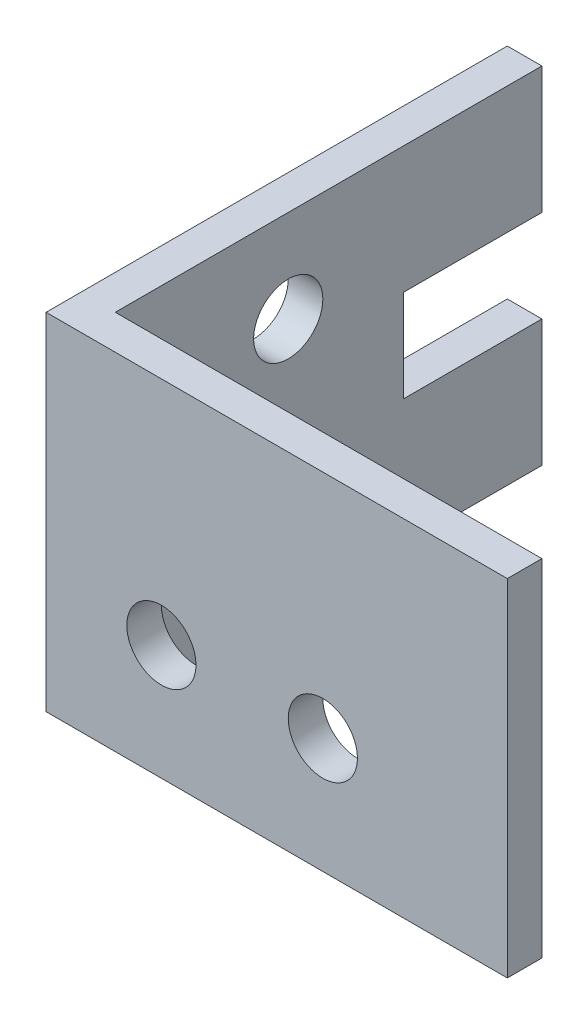
ISO-10303-21;
HEADER;
FILE_DESCRIPTION(('STEP AP214'),'2;1');
FILE_NAME('part.step','',(''),(''),'','','');
FILE_SCHEMA(('AUTOMOTIVE_DESIGN { 1 0 10303 214 1 1 1 1 }'));
ENDSEC;
DATA;
#1=APPLICATION_CONTEXT('core data for automotive mechanical design processes');
#2=APPLICATION_PROTOCOL_DEFINITION('international standard','automotive_design',2000,#1);
#3=PRODUCT_CONTEXT('',#1,'mechanical');
#4=PRODUCT('Part','Part','',(#3));
#5=PRODUCT_RELATED_PRODUCT_CATEGORY('part','',(#4));
#6=PRODUCT_DEFINITION_FORMATION('','',#4);
#7=PRODUCT_DEFINITION_CONTEXT('part definition',#1,'design');
#8=PRODUCT_DEFINITION('design','',#6,#7);
#9=PRODUCT_DEFINITION_SHAPE('','',#8);
#10=(LENGTH_UNIT() NAMED_UNIT(*) SI_UNIT(.MILLI.,.METRE.));
#11=(NAMED_UNIT(*) PLANE_ANGLE_UNIT() SI_UNIT($,.RADIAN.));
#12=(NAMED_UNIT(*) SI_UNIT($,.STERADIAN.) SOLID_ANGLE_UNIT());
#13=UNCERTAINTY_MEASURE_WITH_UNIT(LENGTH_MEASURE(1.E-05),#10,'distance_accuracy_value','');
#14=(GEOMETRIC_REPRESENTATION_CONTEXT(3) GLOBAL_UNCERTAINTY_ASSIGNED_CONTEXT((#13)) GLOBAL_UNIT_ASSIGNED_CONTEXT((#10,
#11,#12)) REPRESENTATION_CONTEXT('',''));
#15=CARTESIAN_POINT('',(0.,0.,0.));
#16=DIRECTION('',(0.,0.,1.));
#17=DIRECTION('',(1.,0.,0.));
#18=AXIS2_PLACEMENT_3D('',#15,#16,#17);
#19=CARTESIAN_POINT('',(-14.8743716496824,15.,-4.40932851023177));
#20=DIRECTION('',(0.,0.,1.));
#21=DIRECTION('',(1.,0.,0.));
#22=AXIS2_PLACEMENT_3D('',#19,#20,#21);
#23=PLANE('',#22);
#24=DIRECTION('',(0.,-1.,0.));
#25=VECTOR('',#24,1.);
#26=CARTESIAN_POINT('',(-13.3743716496824,15.,-4.40932851023177));
#27=LINE('',#26,#25);
#28=CARTESIAN_POINT('',(-13.3743716496824,15.,-4.40932851023177));
#29=VERTEX_POINT('',#28);
#30=CARTESIAN_POINT('',(-13.3743716496824,9.5,-4.40932851023177));
#31=VERTEX_POINT('',#30);
#32=EDGE_CURVE('E146',#29,#31,#27,.T.);
#33=ORIENTED_EDGE('',*,*,#32,.T.);
#34=DIRECTION('',(-1.,0.,0.));
#35=VECTOR('',#34,1.);
#36=CARTESIAN_POINT('',(-14.8743716496824,9.5,-4.40932851023177));
#37=LINE('',#36,#35);
#38=CARTESIAN_POINT('',(-14.8743716496824,9.5,-4.40932851023177));
#39=VERTEX_POINT('',#38);
#40=EDGE_CURVE('E116',#31,#39,#37,.T.);
#41=ORIENTED_EDGE('',*,*,#40,.T.);
#42=DIRECTION('',(0.,-1.,0.));
#43=VECTOR('',#42,1.);
#44=CARTESIAN_POINT('',(-14.8743716496824,15.,-4.40932851023177));
#45=LINE('',#44,#43);
#46=CARTESIAN_POINT('',(-14.8743716496824,15.,-4.40932851023177));
#47=VERTEX_POINT('',#46);
#48=EDGE_CURVE('E114',#47,#39,#45,.T.);
#49=ORIENTED_EDGE('',*,*,#48,.F.);
#50=DIRECTION('',(-1.,0.,0.));
#51=VECTOR('',#50,1.);
#52=CARTESIAN_POINT('',(-14.8743716496824,15.,-4.40932851023177));
#53=LINE('',#52,#51);
#54=EDGE_CURVE('E100',#29,#47,#53,.T.);
#55=ORIENTED_EDGE('',*,*,#54,.F.);
#56=EDGE_LOOP('',(#33,#41,#49,#55));
#57=FACE_BOUND('',#56,.T.);
#58=ADVANCED_FACE('F31',(#57),#23,.F.);
#59=CARTESIAN_POINT('',(5.12562835031758,15.,14.0906714897682));
#60=DIRECTION('',(-1.,0.,0.));
#61=DIRECTION('',(0.,0.,1.));
#62=AXIS2_PLACEMENT_3D('',#59,#60,#61);
#63=PLANE('',#62);
#64=DIRECTION('',(0.,0.,-1.));
#65=VECTOR('',#64,1.);
#66=CARTESIAN_POINT('',(5.12562835031758,0.,14.0906714897682));
#67=LINE('',#66,#65);
#68=CARTESIAN_POINT('',(5.12562835031758,0.,15.5906714897682));
#69=VERTEX_POINT('',#68);
#70=CARTESIAN_POINT('',(5.12562835031758,0.,14.0906714897682));
#71=VERTEX_POINT('',#70);
#72=EDGE_CURVE('E128',#69,#71,#67,.T.);
#73=ORIENTED_EDGE('',*,*,#72,.T.);
#74=DIRECTION('',(0.,-1.,0.));
#75=VECTOR('',#74,1.);
#76=CARTESIAN_POINT('',(5.12562835031758,15.,14.0906714897682));
#77=LINE('',#76,#75);
#78=CARTESIAN_POINT('',(5.12562835031758,15.,14.0906714897682));
#79=VERTEX_POINT('',#78);
#80=EDGE_CURVE('E151',#79,#71,#77,.T.);
#81=ORIENTED_EDGE('',*,*,#80,.F.);
#82=DIRECTION('',(0.,0.,-1.));
#83=VECTOR('',#82,1.);
#84=CARTESIAN_POINT('',(5.12562835031758,15.,14.0906714897682));
#85=LINE('',#84,#83);
#86=CARTESIAN_POINT('',(5.12562835031758,15.,15.5906714897682));
#87=VERTEX_POINT('',#86);
#88=EDGE_CURVE('E143',#87,#79,#85,.T.);
#89=ORIENTED_EDGE('',*,*,#88,.F.);
#90=DIRECTION('',(0.,-1.,0.));
#91=VECTOR('',#90,1.);
#92=CARTESIAN_POINT('',(5.12562835031758,15.,15.5906714897682));
#93=LINE('',#92,#91);
#94=EDGE_CURVE('E124',#87,#69,#93,.T.);
#95=ORIENTED_EDGE('',*,*,#94,.T.);
#96=EDGE_LOOP('',(#73,#81,#89,#95));
#97=FACE_BOUND('',#96,.T.);
#98=ADVANCED_FACE('F33',(#97),#63,.F.);
#99=CARTESIAN_POINT('',(-13.3743716496824,15.,14.0906714897682));
#100=DIRECTION('',(0.,0.,1.));
#101=DIRECTION('',(1.,0.,0.));
#102=AXIS2_PLACEMENT_3D('',#99,#100,#101);
#103=PLANE('',#102);
#104=CARTESIAN_POINT('',(-9.87437164968241,5.,14.0906714897682));
#105=DIRECTION('',(0.,0.,-1.));
#106=DIRECTION('',(-1.,0.,0.));
#107=AXIS2_PLACEMENT_3D('',#104,#105,#106);
#108=CIRCLE('',#107,1.5);
#109=CARTESIAN_POINT('',(-11.3743716496824,5.,14.0906714897682));
#110=VERTEX_POINT('',#109);
#111=EDGE_CURVE('E160',#110,#110,#108,.T.);
#112=ORIENTED_EDGE('',*,*,#111,.F.);
#113=EDGE_LOOP('',(#112));
#114=FACE_BOUND('',#113,.T.);
#115=CARTESIAN_POINT('',(-2.87437164968242,5.,14.0906714897682));
#116=DIRECTION('',(0.,0.,-1.));
#117=DIRECTION('',(-1.,0.,0.));
#118=AXIS2_PLACEMENT_3D('',#115,#116,#117);
#119=CIRCLE('',#118,1.5);
#120=CARTESIAN_POINT('',(-4.37437164968242,5.,14.0906714897682));
#121=VERTEX_POINT('',#120);
#122=EDGE_CURVE('E156',#121,#121,#119,.T.);
#123=ORIENTED_EDGE('',*,*,#122,.F.);
#124=EDGE_LOOP('',(#123));
#125=FACE_BOUND('',#124,.T.);
#126=DIRECTION('',(-1.,0.,0.));
#127=VECTOR('',#126,1.);
#128=CARTESIAN_POINT('',(-13.3743716496824,0.,14.0906714897682));
#129=LINE('',#128,#127);
#130=CARTESIAN_POINT('',(-13.3743716496824,0.,14.0906714897682));
#131=VERTEX_POINT('',#130);
#132=EDGE_CURVE('E131',#71,#131,#129,.T.);
#133=ORIENTED_EDGE('',*,*,#132,.T.);
#134=DIRECTION('',(0.,-1.,0.));
#135=VECTOR('',#134,1.);
#136=CARTESIAN_POINT('',(-13.3743716496824,15.,14.0906714897682));
#137=LINE('',#136,#135);
#138=CARTESIAN_POINT('',(-13.3743716496824,15.,14.0906714897682));
#139=VERTEX_POINT('',#138);
#140=EDGE_CURVE('E148',#139,#131,#137,.T.);
#141=ORIENTED_EDGE('',*,*,#140,.F.);
#142=DIRECTION('',(-1.,0.,0.));
#143=VECTOR('',#142,1.);
#144=CARTESIAN_POINT('',(-13.3743716496824,15.,14.0906714897682));
#145=LINE('',#144,#143);
#146=EDGE_CURVE('E91',#79,#139,#145,.T.);
#147=ORIENTED_EDGE('',*,*,#146,.F.);
#148=ORIENTED_EDGE('',*,*,#80,.T.);
#149=EDGE_LOOP('',(#133,#141,#147,#148));
#150=FACE_BOUND('',#149,.T.);
#151=ADVANCED_FACE('F212',(#114,#125,#150),#103,.F.);
#152=CARTESIAN_POINT('',(-13.3743716496824,15.,-4.40932851023177));
#153=DIRECTION('',(-1.,0.,0.));
#154=DIRECTION('',(0.,0.,1.));
#155=AXIS2_PLACEMENT_3D('',#152,#153,#154);
#156=PLANE('',#155);
#157=CARTESIAN_POINT('',(-13.3743716496824,11.,6.59067148976823));
#158=DIRECTION('',(1.,0.,0.));
#159=DIRECTION('',(0.,0.,-1.));
#160=AXIS2_PLACEMENT_3D('',#157,#158,#159);
#161=CIRCLE('',#160,1.5);
#162=CARTESIAN_POINT('',(-13.3743716496824,11.,5.09067148976822));
#163=VERTEX_POINT('',#162);
#164=EDGE_CURVE('E168',#163,#163,#161,.T.);
#165=ORIENTED_EDGE('',*,*,#164,.F.);
#166=EDGE_LOOP('',(#165));
#167=FACE_BOUND('',#166,.T.);
#168=CARTESIAN_POINT('',(-13.3743716496824,4.,6.59067148976823));
#169=DIRECTION('',(1.,0.,0.));
#170=DIRECTION('',(0.,0.,-1.));
#171=AXIS2_PLACEMENT_3D('',#168,#169,#170);
#172=CIRCLE('',#171,1.5);
#173=CARTESIAN_POINT('',(-13.3743716496824,4.,5.09067148976822));
#174=VERTEX_POINT('',#173);
#175=EDGE_CURVE('E164',#174,#174,#172,.T.);
#176=ORIENTED_EDGE('',*,*,#175,.F.);
#177=EDGE_LOOP('',(#176));
#178=FACE_BOUND('',#177,.T.);
#179=DIRECTION('',(0.,-1.,0.));
#180=VECTOR('',#179,1.);
#181=CARTESIAN_POINT('',(-13.3743716496824,9.5,1.59067148976823));
#182=LINE('',#181,#180);
#183=CARTESIAN_POINT('',(-13.3743716496824,9.5,1.59067148976823));
#184=VERTEX_POINT('',#183);
#185=CARTESIAN_POINT('',(-13.3743716496824,5.5,1.59067148976823));
#186=VERTEX_POINT('',#185);
#187=EDGE_CURVE('E224',#184,#186,#182,.T.);
#188=ORIENTED_EDGE('',*,*,#187,.F.);
#189=DIRECTION('',(0.,0.,1.));
#190=VECTOR('',#189,1.);
#191=CARTESIAN_POINT('',(-13.3743716496824,9.5,1.59067148976823));
#192=LINE('',#191,#190);
#193=EDGE_CURVE('E192',#31,#184,#192,.T.);
#194=ORIENTED_EDGE('',*,*,#193,.F.);
#195=ORIENTED_EDGE('',*,*,#32,.F.);
#196=DIRECTION('',(0.,0.,-1.));
#197=VECTOR('',#196,1.);
#198=CARTESIAN_POINT('',(-13.3743716496824,15.,-4.40932851023177));
#199=LINE('',#198,#197);
#200=EDGE_CURVE('E107',#139,#29,#199,.T.);
#201=ORIENTED_EDGE('',*,*,#200,.F.);
#202=ORIENTED_EDGE('',*,*,#140,.T.);
#203=DIRECTION('',(0.,0.,-1.));
#204=VECTOR('',#203,1.);
#205=CARTESIAN_POINT('',(-13.3743716496824,0.,-4.40932851023177));
#206=LINE('',#205,#204);
#207=CARTESIAN_POINT('',(-13.3743716496824,0.,-4.40932851023177));
#208=VERTEX_POINT('',#207);
#209=EDGE_CURVE('E134',#131,#208,#206,.T.);
#210=ORIENTED_EDGE('',*,*,#209,.T.);
#211=CARTESIAN_POINT('',(-13.3743716496824,5.5,-4.40932851023177));
#212=VERTEX_POINT('',#211);
#213=EDGE_CURVE('E118',#212,#208,#27,.T.);
#214=ORIENTED_EDGE('',*,*,#213,.F.);
#215=DIRECTION('',(0.,0.,-1.));
#216=VECTOR('',#215,1.);
#217=CARTESIAN_POINT('',(-13.3743716496824,5.5,1.59067148976823));
#218=LINE('',#217,#216);
#219=EDGE_CURVE('E223',#186,#212,#218,.T.);
#220=ORIENTED_EDGE('',*,*,#219,.F.);
#221=EDGE_LOOP('',(#188,#194,#195,#201,#202,#210,#214,#220));
#222=FACE_BOUND('',#221,.T.);
#223=ADVANCED_FACE('F215',(#167,#178,#222),#156,.F.);
#224=CARTESIAN_POINT('',(-14.8743716496824,5.5,-4.40932851023177));
#225=VERTEX_POINT('',#224);
#226=CARTESIAN_POINT('',(-14.8743716496824,0.,-4.40932851023177));
#227=VERTEX_POINT('',#226);
#228=EDGE_CURVE('E119',#225,#227,#45,.T.);
#229=ORIENTED_EDGE('',*,*,#228,.F.);
#230=DIRECTION('',(1.,0.,0.));
#231=VECTOR('',#230,1.);
#232=CARTESIAN_POINT('',(-14.8743716496824,5.5,-4.40932851023177));
#233=LINE('',#232,#231);
#234=EDGE_CURVE('E46',#225,#212,#233,.T.);
#235=ORIENTED_EDGE('',*,*,#234,.T.);
#236=ORIENTED_EDGE('',*,*,#213,.T.);
#237=DIRECTION('',(-1.,0.,0.));
#238=VECTOR('',#237,1.);
#239=CARTESIAN_POINT('',(-14.8743716496824,0.,-4.40932851023177));
#240=LINE('',#239,#238);
#241=EDGE_CURVE('E137',#208,#227,#240,.T.);
#242=ORIENTED_EDGE('',*,*,#241,.T.);
#243=EDGE_LOOP('',(#229,#235,#236,#242));
#244=FACE_BOUND('',#243,.T.);
#245=ADVANCED_FACE('F229',(#244),#23,.F.);
#246=CARTESIAN_POINT('',(-14.8743716496824,15.,15.5906714897682));
#247=DIRECTION('',(1.,0.,0.));
#248=DIRECTION('',(0.,0.,-1.));
#249=AXIS2_PLACEMENT_3D('',#246,#247,#248);
#250=PLANE('',#249);
#251=CARTESIAN_POINT('',(-14.8743716496824,11.,6.59067148976823));
#252=DIRECTION('',(1.,0.,0.));
#253=DIRECTION('',(0.,0.,-1.));
#254=AXIS2_PLACEMENT_3D('',#251,#252,#253);
#255=CIRCLE('',#254,1.5);
#256=CARTESIAN_POINT('',(-14.8743716496824,11.,5.09067148976822));
#257=VERTEX_POINT('',#256);
#258=EDGE_CURVE('E165',#257,#257,#255,.T.);
#259=ORIENTED_EDGE('',*,*,#258,.T.);
#260=EDGE_LOOP('',(#259));
#261=FACE_BOUND('',#260,.T.);
#262=CARTESIAN_POINT('',(-14.8743716496824,4.,6.59067148976823));
#263=DIRECTION('',(1.,0.,0.));
#264=DIRECTION('',(0.,0.,-1.));
#265=AXIS2_PLACEMENT_3D('',#262,#263,#264);
#266=CIRCLE('',#265,1.5);
#267=CARTESIAN_POINT('',(-14.8743716496824,4.,5.09067148976822));
#268=VERTEX_POINT('',#267);
#269=EDGE_CURVE('E161',#268,#268,#266,.T.);
#270=ORIENTED_EDGE('',*,*,#269,.T.);
#271=EDGE_LOOP('',(#270));
#272=FACE_BOUND('',#271,.T.);
#273=ORIENTED_EDGE('',*,*,#48,.T.);
#274=DIRECTION('',(0.,0.,1.));
#275=VECTOR('',#274,1.);
#276=CARTESIAN_POINT('',(-14.8743716496824,9.5,15.5906714897682));
#277=LINE('',#276,#275);
#278=CARTESIAN_POINT('',(-14.8743716496824,9.5,1.59067148976823));
#279=VERTEX_POINT('',#278);
#280=EDGE_CURVE('E11',#39,#279,#277,.T.);
#281=ORIENTED_EDGE('',*,*,#280,.T.);
#282=DIRECTION('',(0.,-1.,0.));
#283=VECTOR('',#282,1.);
#284=CARTESIAN_POINT('',(-14.8743716496824,15.,1.59067148976823));
#285=LINE('',#284,#283);
#286=CARTESIAN_POINT('',(-14.8743716496824,5.5,1.59067148976823));
#287=VERTEX_POINT('',#286);
#288=EDGE_CURVE('E39',#279,#287,#285,.T.);
#289=ORIENTED_EDGE('',*,*,#288,.T.);
#290=DIRECTION('',(0.,0.,-1.));
#291=VECTOR('',#290,1.);
#292=CARTESIAN_POINT('',(-14.8743716496824,5.5,15.5906714897682));
#293=LINE('',#292,#291);
#294=EDGE_CURVE('E153',#287,#225,#293,.T.);
#295=ORIENTED_EDGE('',*,*,#294,.T.);
#296=ORIENTED_EDGE('',*,*,#228,.T.);
#297=DIRECTION('',(0.,0.,1.));
#298=VECTOR('',#297,1.);
#299=CARTESIAN_POINT('',(-14.8743716496824,0.,15.5906714897682));
#300=LINE('',#299,#298);
#301=CARTESIAN_POINT('',(-14.8743716496824,0.,15.5906714897682));
#302=VERTEX_POINT('',#301);
#303=EDGE_CURVE('E140',#227,#302,#300,.T.);
#304=ORIENTED_EDGE('',*,*,#303,.T.);
#305=DIRECTION('',(0.,-1.,0.));
#306=VECTOR('',#305,1.);
#307=CARTESIAN_POINT('',(-14.8743716496824,15.,15.5906714897682));
#308=LINE('',#307,#306);
#309=CARTESIAN_POINT('',(-14.8743716496824,15.,15.5906714897682));
#310=VERTEX_POINT('',#309);
#311=EDGE_CURVE('E122',#310,#302,#308,.T.);
#312=ORIENTED_EDGE('',*,*,#311,.F.);
#313=DIRECTION('',(0.,0.,1.));
#314=VECTOR('',#313,1.);
#315=CARTESIAN_POINT('',(-14.8743716496824,15.,15.5906714897682));
#316=LINE('',#315,#314);
#317=EDGE_CURVE('E104',#47,#310,#316,.T.);
#318=ORIENTED_EDGE('',*,*,#317,.F.);
#319=EDGE_LOOP('',(#273,#281,#289,#295,#296,#304,#312,#318));
#320=FACE_BOUND('',#319,.T.);
#321=ADVANCED_FACE('F121',(#261,#272,#320),#250,.F.);
#322=CARTESIAN_POINT('',(5.12562835031758,15.,15.5906714897682));
#323=DIRECTION('',(0.,0.,-1.));
#324=DIRECTION('',(-1.,0.,0.));
#325=AXIS2_PLACEMENT_3D('',#322,#323,#324);
#326=PLANE('',#325);
#327=CARTESIAN_POINT('',(-9.87437164968242,5.,15.5906714897682));
#328=DIRECTION('',(0.,0.,-1.));
#329=DIRECTION('',(-1.,0.,0.));
#330=AXIS2_PLACEMENT_3D('',#327,#328,#329);
#331=CIRCLE('',#330,1.5);
#332=CARTESIAN_POINT('',(-11.3743716496824,5.,15.5906714897682));
#333=VERTEX_POINT('',#332);
#334=EDGE_CURVE('E157',#333,#333,#331,.T.);
#335=ORIENTED_EDGE('',*,*,#334,.T.);
#336=EDGE_LOOP('',(#335));
#337=FACE_BOUND('',#336,.T.);
#338=CARTESIAN_POINT('',(-2.87437164968242,5.,15.5906714897682));
#339=DIRECTION('',(0.,0.,-1.));
#340=DIRECTION('',(-1.,0.,0.));
#341=AXIS2_PLACEMENT_3D('',#338,#339,#340);
#342=CIRCLE('',#341,1.5);
#343=CARTESIAN_POINT('',(-4.37437164968242,5.,15.5906714897682));
#344=VERTEX_POINT('',#343);
#345=EDGE_CURVE('E132',#344,#344,#342,.T.);
#346=ORIENTED_EDGE('',*,*,#345,.T.);
#347=EDGE_LOOP('',(#346));
#348=FACE_BOUND('',#347,.T.);
#349=DIRECTION('',(1.,0.,0.));
#350=VECTOR('',#349,1.);
#351=CARTESIAN_POINT('',(5.12562835031758,0.,15.5906714897682));
#352=LINE('',#351,#350);
#353=EDGE_CURVE('E82',#302,#69,#352,.T.);
#354=ORIENTED_EDGE('',*,*,#353,.T.);
#355=ORIENTED_EDGE('',*,*,#94,.F.);
#356=DIRECTION('',(1.,0.,0.));
#357=VECTOR('',#356,1.);
#358=CARTESIAN_POINT('',(5.12562835031758,15.,15.5906714897682));
#359=LINE('',#358,#357);
#360=EDGE_CURVE('E55',#310,#87,#359,.T.);
#361=ORIENTED_EDGE('',*,*,#360,.F.);
#362=ORIENTED_EDGE('',*,*,#311,.T.);
#363=EDGE_LOOP('',(#354,#355,#361,#362));
#364=FACE_BOUND('',#363,.T.);
#365=ADVANCED_FACE('F232',(#337,#348,#364),#326,.F.);
#366=CARTESIAN_POINT('',(5.12562835031758,15.,15.5906714897682));
#367=DIRECTION('',(0.,-1.,0.));
#368=DIRECTION('',(0.,0.,-1.));
#369=AXIS2_PLACEMENT_3D('',#366,#367,#368);
#370=PLANE('',#369);
#371=ORIENTED_EDGE('',*,*,#88,.T.);
#372=ORIENTED_EDGE('',*,*,#146,.T.);
#373=ORIENTED_EDGE('',*,*,#200,.T.);
#374=ORIENTED_EDGE('',*,*,#54,.T.);
#375=ORIENTED_EDGE('',*,*,#317,.T.);
#376=ORIENTED_EDGE('',*,*,#360,.T.);
#377=EDGE_LOOP('',(#371,#372,#373,#374,#375,#376));
#378=FACE_BOUND('',#377,.T.);
#379=ADVANCED_FACE('F102',(#378),#370,.F.);
#380=CARTESIAN_POINT('',(5.12562835031758,0.,15.5906714897682));
#381=DIRECTION('',(0.,-1.,0.));
#382=DIRECTION('',(0.,0.,-1.));
#383=AXIS2_PLACEMENT_3D('',#380,#381,#382);
#384=PLANE('',#383);
#385=ORIENTED_EDGE('',*,*,#72,.F.);
#386=ORIENTED_EDGE('',*,*,#353,.F.);
#387=ORIENTED_EDGE('',*,*,#303,.F.);
#388=ORIENTED_EDGE('',*,*,#241,.F.);
#389=ORIENTED_EDGE('',*,*,#209,.F.);
#390=ORIENTED_EDGE('',*,*,#132,.F.);
#391=EDGE_LOOP('',(#385,#386,#387,#388,#389,#390));
#392=FACE_BOUND('',#391,.T.);
#393=ADVANCED_FACE('F234',(#392),#384,.T.);
#394=CARTESIAN_POINT('',(-2.87437164968243,5.,54.0906714897682));
#395=DIRECTION('',(0.,0.,-1.));
#396=DIRECTION('',(-1.,0.,0.));
#397=AXIS2_PLACEMENT_3D('',#394,#395,#396);
#398=CYLINDRICAL_SURFACE('',#397,1.5);
#399=ORIENTED_EDGE('',*,*,#122,.T.);
#400=EDGE_LOOP('',(#399));
#401=FACE_BOUND('',#400,.T.);
#402=ORIENTED_EDGE('',*,*,#345,.F.);
#403=EDGE_LOOP('',(#402));
#404=FACE_BOUND('',#403,.T.);
#405=ADVANCED_FACE('F274',(#401,#404),#398,.F.);
#406=CARTESIAN_POINT('',(-9.87437164968243,5.,54.0906714897682));
#407=DIRECTION('',(0.,0.,-1.));
#408=DIRECTION('',(-1.,0.,0.));
#409=AXIS2_PLACEMENT_3D('',#406,#407,#408);
#410=CYLINDRICAL_SURFACE('',#409,1.5);
#411=ORIENTED_EDGE('',*,*,#111,.T.);
#412=EDGE_LOOP('',(#411));
#413=FACE_BOUND('',#412,.T.);
#414=ORIENTED_EDGE('',*,*,#334,.F.);
#415=EDGE_LOOP('',(#414));
#416=FACE_BOUND('',#415,.T.);
#417=ADVANCED_FACE('F264',(#413,#416),#410,.F.);
#418=CARTESIAN_POINT('',(-53.3743716496824,4.,6.59067148976824));
#419=DIRECTION('',(1.,0.,0.));
#420=DIRECTION('',(0.,0.,-1.));
#421=AXIS2_PLACEMENT_3D('',#418,#419,#420);
#422=CYLINDRICAL_SURFACE('',#421,1.5);
#423=ORIENTED_EDGE('',*,*,#175,.T.);
#424=EDGE_LOOP('',(#423));
#425=FACE_BOUND('',#424,.T.);
#426=ORIENTED_EDGE('',*,*,#269,.F.);
#427=EDGE_LOOP('',(#426));
#428=FACE_BOUND('',#427,.T.);
#429=ADVANCED_FACE('F260',(#425,#428),#422,.F.);
#430=CARTESIAN_POINT('',(-53.3743716496824,11.,6.59067148976825));
#431=DIRECTION('',(1.,0.,0.));
#432=DIRECTION('',(0.,0.,-1.));
#433=AXIS2_PLACEMENT_3D('',#430,#431,#432);
#434=CYLINDRICAL_SURFACE('',#433,1.5);
#435=ORIENTED_EDGE('',*,*,#164,.T.);
#436=EDGE_LOOP('',(#435));
#437=FACE_BOUND('',#436,.T.);
#438=ORIENTED_EDGE('',*,*,#258,.F.);
#439=EDGE_LOOP('',(#438));
#440=FACE_BOUND('',#439,.T.);
#441=ADVANCED_FACE('F263',(#437,#440),#434,.F.);
#442=CARTESIAN_POINT('',(-53.3743716496824,9.5,1.59067148976825));
#443=DIRECTION('',(0.,0.,1.));
#444=DIRECTION('',(1.,0.,0.));
#445=AXIS2_PLACEMENT_3D('',#442,#443,#444);
#446=PLANE('',#445);
#447=DIRECTION('',(1.,0.,0.));
#448=VECTOR('',#447,1.);
#449=CARTESIAN_POINT('',(-53.3743716496824,9.5,1.59067148976825));
#450=LINE('',#449,#448);
#451=EDGE_CURVE('E185',#279,#184,#450,.T.);
#452=ORIENTED_EDGE('',*,*,#451,.T.);
#453=ORIENTED_EDGE('',*,*,#187,.T.);
#454=DIRECTION('',(1.,0.,0.));
#455=VECTOR('',#454,1.);
#456=CARTESIAN_POINT('',(-53.3743716496824,5.5,1.59067148976825));
#457=LINE('',#456,#455);
#458=EDGE_CURVE('E188',#287,#186,#457,.T.);
#459=ORIENTED_EDGE('',*,*,#458,.F.);
#460=ORIENTED_EDGE('',*,*,#288,.F.);
#461=EDGE_LOOP('',(#452,#453,#459,#460));
#462=FACE_BOUND('',#461,.T.);
#463=ADVANCED_FACE('F182',(#462),#446,.F.);
#464=CARTESIAN_POINT('',(-53.3743716496824,9.5,1.59067148976825));
#465=DIRECTION('',(0.,1.,0.));
#466=DIRECTION('',(0.,0.,1.));
#467=AXIS2_PLACEMENT_3D('',#464,#465,#466);
#468=PLANE('',#467);
#469=ORIENTED_EDGE('',*,*,#193,.T.);
#470=ORIENTED_EDGE('',*,*,#451,.F.);
#471=ORIENTED_EDGE('',*,*,#280,.F.);
#472=ORIENTED_EDGE('',*,*,#40,.F.);
#473=EDGE_LOOP('',(#469,#470,#471,#472));
#474=FACE_BOUND('',#473,.T.);
#475=ADVANCED_FACE('F190',(#474),#468,.F.);
#476=CARTESIAN_POINT('',(-53.3743716496824,5.5,1.59067148976825));
#477=DIRECTION('',(0.,-1.,0.));
#478=DIRECTION('',(0.,0.,-1.));
#479=AXIS2_PLACEMENT_3D('',#476,#477,#478);
#480=PLANE('',#479);
#481=ORIENTED_EDGE('',*,*,#294,.F.);
#482=ORIENTED_EDGE('',*,*,#458,.T.);
#483=ORIENTED_EDGE('',*,*,#219,.T.);
#484=ORIENTED_EDGE('',*,*,#234,.F.);
#485=EDGE_LOOP('',(#481,#482,#483,#484));
#486=FACE_BOUND('',#485,.T.);
#487=ADVANCED_FACE('F221',(#486),#480,.F.);
#488=CLOSED_SHELL('',(#58,#98,#151,#223,#245,#321,#365,#379,#393,#405,#417,#429,#441,#463,#475,#487));
#489=MANIFOLD_SOLID_BREP('B2',#488);
#490=ADVANCED_BREP_SHAPE_REPRESENTATION('',(#18,#489),#14);
#491=SHAPE_DEFINITION_REPRESENTATION(#9,#490);
ENDSEC;
END-ISO-10303-21;
